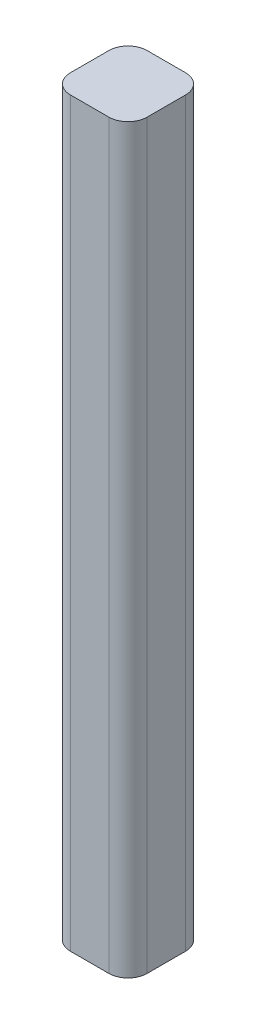
ISO-10303-21;
HEADER;
FILE_DESCRIPTION(('STEP AP214'),'2;1');
FILE_NAME('part.step','',(''),(''),'','','');
FILE_SCHEMA(('AUTOMOTIVE_DESIGN { 1 0 10303 214 1 1 1 1 }'));
ENDSEC;
DATA;
#1=APPLICATION_CONTEXT('core data for automotive mechanical design processes');
#2=APPLICATION_PROTOCOL_DEFINITION('international standard','automotive_design',2000,#1);
#3=PRODUCT_CONTEXT('',#1,'mechanical');
#4=PRODUCT('Part','Part','',(#3));
#5=PRODUCT_RELATED_PRODUCT_CATEGORY('part','',(#4));
#6=PRODUCT_DEFINITION_FORMATION('','',#4);
#7=PRODUCT_DEFINITION_CONTEXT('part definition',#1,'design');
#8=PRODUCT_DEFINITION('design','',#6,#7);
#9=PRODUCT_DEFINITION_SHAPE('','',#8);
#10=(LENGTH_UNIT() NAMED_UNIT(*) SI_UNIT(.MILLI.,.METRE.));
#11=(NAMED_UNIT(*) PLANE_ANGLE_UNIT() SI_UNIT($,.RADIAN.));
#12=(NAMED_UNIT(*) SI_UNIT($,.STERADIAN.) SOLID_ANGLE_UNIT());
#13=UNCERTAINTY_MEASURE_WITH_UNIT(LENGTH_MEASURE(1.E-05),#10,'distance_accuracy_value','');
#14=(GEOMETRIC_REPRESENTATION_CONTEXT(3) GLOBAL_UNCERTAINTY_ASSIGNED_CONTEXT((#13)) GLOBAL_UNIT_ASSIGNED_CONTEXT((#10,
#11,#12)) REPRESENTATION_CONTEXT('',''));
#15=CARTESIAN_POINT('',(0.,0.,0.));
#16=DIRECTION('',(0.,0.,1.));
#17=DIRECTION('',(1.,0.,0.));
#18=AXIS2_PLACEMENT_3D('',#15,#16,#17);
#19=CARTESIAN_POINT('',(2.,77.25,-2.));
#20=DIRECTION('',(0.,-1.,0.));
#21=DIRECTION('',(0.,0.,-1.));
#22=AXIS2_PLACEMENT_3D('',#19,#20,#21);
#23=CYLINDRICAL_SURFACE('',#22,2.);
#24=CARTESIAN_POINT('',(2.,0.,-2.));
#25=DIRECTION('',(0.,1.,0.));
#26=DIRECTION('',(0.,0.,-1.));
#27=AXIS2_PLACEMENT_3D('',#24,#25,#26);
#28=CIRCLE('',#27,2.);
#29=CARTESIAN_POINT('',(4.,0.,-2.));
#30=VERTEX_POINT('',#29);
#31=CARTESIAN_POINT('',(2.,0.,-4.));
#32=VERTEX_POINT('',#31);
#33=EDGE_CURVE('E129',#30,#32,#28,.T.);
#34=ORIENTED_EDGE('',*,*,#33,.T.);
#35=DIRECTION('',(0.,-1.,0.));
#36=VECTOR('',#35,1.);
#37=CARTESIAN_POINT('',(2.,77.25,-4.));
#38=LINE('',#37,#36);
#39=CARTESIAN_POINT('',(2.,77.25,-4.));
#40=VERTEX_POINT('',#39);
#41=EDGE_CURVE('E11',#40,#32,#38,.T.);
#42=ORIENTED_EDGE('',*,*,#41,.F.);
#43=CARTESIAN_POINT('',(2.,77.25,-2.));
#44=DIRECTION('',(0.,1.,0.));
#45=DIRECTION('',(0.,0.,-1.));
#46=AXIS2_PLACEMENT_3D('',#43,#44,#45);
#47=CIRCLE('',#46,2.);
#48=CARTESIAN_POINT('',(4.,77.25,-2.));
#49=VERTEX_POINT('',#48);
#50=EDGE_CURVE('E143',#49,#40,#47,.T.);
#51=ORIENTED_EDGE('',*,*,#50,.F.);
#52=DIRECTION('',(0.,-1.,0.));
#53=VECTOR('',#52,1.);
#54=CARTESIAN_POINT('',(4.,77.25,-2.));
#55=LINE('',#54,#53);
#56=EDGE_CURVE('E125',#49,#30,#55,.T.);
#57=ORIENTED_EDGE('',*,*,#56,.T.);
#58=EDGE_LOOP('',(#34,#42,#51,#57));
#59=FACE_BOUND('',#58,.T.);
#60=ADVANCED_FACE('F33',(#59),#23,.T.);
#61=CARTESIAN_POINT('',(-2.,77.25,-4.));
#62=DIRECTION('',(0.,0.,1.));
#63=DIRECTION('',(1.,0.,0.));
#64=AXIS2_PLACEMENT_3D('',#61,#62,#63);
#65=PLANE('',#64);
#66=DIRECTION('',(-1.,0.,0.));
#67=VECTOR('',#66,1.);
#68=CARTESIAN_POINT('',(-2.,0.,-4.));
#69=LINE('',#68,#67);
#70=CARTESIAN_POINT('',(-2.,0.,-4.));
#71=VERTEX_POINT('',#70);
#72=EDGE_CURVE('E132',#32,#71,#69,.T.);
#73=ORIENTED_EDGE('',*,*,#72,.T.);
#74=DIRECTION('',(0.,-1.,0.));
#75=VECTOR('',#74,1.);
#76=CARTESIAN_POINT('',(-2.,77.25,-4.));
#77=LINE('',#76,#75);
#78=CARTESIAN_POINT('',(-2.,77.25,-4.));
#79=VERTEX_POINT('',#78);
#80=EDGE_CURVE('E41',#79,#71,#77,.T.);
#81=ORIENTED_EDGE('',*,*,#80,.F.);
#82=DIRECTION('',(-1.,0.,0.));
#83=VECTOR('',#82,1.);
#84=CARTESIAN_POINT('',(-2.,77.25,-4.));
#85=LINE('',#84,#83);
#86=EDGE_CURVE('E92',#40,#79,#85,.T.);
#87=ORIENTED_EDGE('',*,*,#86,.F.);
#88=ORIENTED_EDGE('',*,*,#41,.T.);
#89=EDGE_LOOP('',(#73,#81,#87,#88));
#90=FACE_BOUND('',#89,.T.);
#91=ADVANCED_FACE('F178',(#90),#65,.F.);
#92=CARTESIAN_POINT('',(-2.,77.25,-2.));
#93=DIRECTION('',(0.,-1.,0.));
#94=DIRECTION('',(0.,0.,-1.));
#95=AXIS2_PLACEMENT_3D('',#92,#93,#94);
#96=CYLINDRICAL_SURFACE('',#95,2.);
#97=CARTESIAN_POINT('',(-2.,0.,-2.));
#98=DIRECTION('',(0.,1.,0.));
#99=DIRECTION('',(0.,0.,-1.));
#100=AXIS2_PLACEMENT_3D('',#97,#98,#99);
#101=CIRCLE('',#100,2.);
#102=CARTESIAN_POINT('',(-4.,0.,-2.));
#103=VERTEX_POINT('',#102);
#104=EDGE_CURVE('E134',#71,#103,#101,.T.);
#105=ORIENTED_EDGE('',*,*,#104,.T.);
#106=DIRECTION('',(0.,-1.,0.));
#107=VECTOR('',#106,1.);
#108=CARTESIAN_POINT('',(-4.,77.25,-2.));
#109=LINE('',#108,#107);
#110=CARTESIAN_POINT('',(-4.,77.25,-2.));
#111=VERTEX_POINT('',#110);
#112=EDGE_CURVE('E150',#111,#103,#109,.T.);
#113=ORIENTED_EDGE('',*,*,#112,.F.);
#114=CARTESIAN_POINT('',(-2.,77.25,-2.));
#115=DIRECTION('',(0.,1.,0.));
#116=DIRECTION('',(0.,0.,-1.));
#117=AXIS2_PLACEMENT_3D('',#114,#115,#116);
#118=CIRCLE('',#117,2.);
#119=EDGE_CURVE('E158',#79,#111,#118,.T.);
#120=ORIENTED_EDGE('',*,*,#119,.F.);
#121=ORIENTED_EDGE('',*,*,#80,.T.);
#122=EDGE_LOOP('',(#105,#113,#120,#121));
#123=FACE_BOUND('',#122,.T.);
#124=ADVANCED_FACE('F156',(#123),#96,.T.);
#125=CARTESIAN_POINT('',(-4.,77.25,2.));
#126=DIRECTION('',(1.,0.,0.));
#127=DIRECTION('',(0.,0.,-1.));
#128=AXIS2_PLACEMENT_3D('',#125,#126,#127);
#129=PLANE('',#128);
#130=DIRECTION('',(0.,0.,1.));
#131=VECTOR('',#130,1.);
#132=CARTESIAN_POINT('',(-4.,0.,2.));
#133=LINE('',#132,#131);
#134=CARTESIAN_POINT('',(-4.,0.,2.));
#135=VERTEX_POINT('',#134);
#136=EDGE_CURVE('E136',#103,#135,#133,.T.);
#137=ORIENTED_EDGE('',*,*,#136,.T.);
#138=DIRECTION('',(0.,-1.,0.));
#139=VECTOR('',#138,1.);
#140=CARTESIAN_POINT('',(-4.,77.25,2.));
#141=LINE('',#140,#139);
#142=CARTESIAN_POINT('',(-4.,77.25,2.));
#143=VERTEX_POINT('',#142);
#144=EDGE_CURVE('E147',#143,#135,#141,.T.);
#145=ORIENTED_EDGE('',*,*,#144,.F.);
#146=DIRECTION('',(0.,0.,1.));
#147=VECTOR('',#146,1.);
#148=CARTESIAN_POINT('',(-4.,77.25,2.));
#149=LINE('',#148,#147);
#150=EDGE_CURVE('E170',#111,#143,#149,.T.);
#151=ORIENTED_EDGE('',*,*,#150,.F.);
#152=ORIENTED_EDGE('',*,*,#112,.T.);
#153=EDGE_LOOP('',(#137,#145,#151,#152));
#154=FACE_BOUND('',#153,.T.);
#155=ADVANCED_FACE('F166',(#154),#129,.F.);
#156=CARTESIAN_POINT('',(-2.,77.25,2.));
#157=DIRECTION('',(0.,-1.,0.));
#158=DIRECTION('',(0.,0.,-1.));
#159=AXIS2_PLACEMENT_3D('',#156,#157,#158);
#160=CYLINDRICAL_SURFACE('',#159,2.);
#161=CARTESIAN_POINT('',(-2.,0.,2.));
#162=DIRECTION('',(0.,1.,0.));
#163=DIRECTION('',(0.,0.,-1.));
#164=AXIS2_PLACEMENT_3D('',#161,#162,#163);
#165=CIRCLE('',#164,2.);
#166=CARTESIAN_POINT('',(-2.,0.,4.));
#167=VERTEX_POINT('',#166);
#168=EDGE_CURVE('E138',#135,#167,#165,.T.);
#169=ORIENTED_EDGE('',*,*,#168,.T.);
#170=DIRECTION('',(0.,-1.,0.));
#171=VECTOR('',#170,1.);
#172=CARTESIAN_POINT('',(-2.,77.25,4.));
#173=LINE('',#172,#171);
#174=CARTESIAN_POINT('',(-2.,77.25,4.));
#175=VERTEX_POINT('',#174);
#176=EDGE_CURVE('E120',#175,#167,#173,.T.);
#177=ORIENTED_EDGE('',*,*,#176,.F.);
#178=CARTESIAN_POINT('',(-2.,77.25,2.));
#179=DIRECTION('',(0.,1.,0.));
#180=DIRECTION('',(0.,0.,-1.));
#181=AXIS2_PLACEMENT_3D('',#178,#179,#180);
#182=CIRCLE('',#181,2.);
#183=EDGE_CURVE('E111',#143,#175,#182,.T.);
#184=ORIENTED_EDGE('',*,*,#183,.F.);
#185=ORIENTED_EDGE('',*,*,#144,.T.);
#186=EDGE_LOOP('',(#169,#177,#184,#185));
#187=FACE_BOUND('',#186,.T.);
#188=ADVANCED_FACE('F169',(#187),#160,.T.);
#189=CARTESIAN_POINT('',(-2.,77.25,4.));
#190=DIRECTION('',(0.,0.,-1.));
#191=DIRECTION('',(-1.,0.,0.));
#192=AXIS2_PLACEMENT_3D('',#189,#190,#191);
#193=PLANE('',#192);
#194=DIRECTION('',(1.,0.,0.));
#195=VECTOR('',#194,1.);
#196=CARTESIAN_POINT('',(-2.,0.,4.));
#197=LINE('',#196,#195);
#198=CARTESIAN_POINT('',(2.,0.,4.));
#199=VERTEX_POINT('',#198);
#200=EDGE_CURVE('E119',#167,#199,#197,.T.);
#201=ORIENTED_EDGE('',*,*,#200,.T.);
#202=DIRECTION('',(0.,-1.,0.));
#203=VECTOR('',#202,1.);
#204=CARTESIAN_POINT('',(2.,77.25,4.));
#205=LINE('',#204,#203);
#206=CARTESIAN_POINT('',(2.,77.25,4.));
#207=VERTEX_POINT('',#206);
#208=EDGE_CURVE('E116',#207,#199,#205,.T.);
#209=ORIENTED_EDGE('',*,*,#208,.F.);
#210=DIRECTION('',(1.,0.,0.));
#211=VECTOR('',#210,1.);
#212=CARTESIAN_POINT('',(-2.,77.25,4.));
#213=LINE('',#212,#211);
#214=EDGE_CURVE('E105',#175,#207,#213,.T.);
#215=ORIENTED_EDGE('',*,*,#214,.F.);
#216=ORIENTED_EDGE('',*,*,#176,.T.);
#217=EDGE_LOOP('',(#201,#209,#215,#216));
#218=FACE_BOUND('',#217,.T.);
#219=ADVANCED_FACE('F117',(#218),#193,.F.);
#220=CARTESIAN_POINT('',(2.,77.25,2.));
#221=DIRECTION('',(0.,-1.,0.));
#222=DIRECTION('',(0.,0.,-1.));
#223=AXIS2_PLACEMENT_3D('',#220,#221,#222);
#224=CYLINDRICAL_SURFACE('',#223,2.);
#225=CARTESIAN_POINT('',(2.,0.,2.));
#226=DIRECTION('',(0.,1.,0.));
#227=DIRECTION('',(0.,0.,-1.));
#228=AXIS2_PLACEMENT_3D('',#225,#226,#227);
#229=CIRCLE('',#228,2.);
#230=CARTESIAN_POINT('',(4.,0.,2.));
#231=VERTEX_POINT('',#230);
#232=EDGE_CURVE('E78',#199,#231,#229,.T.);
#233=ORIENTED_EDGE('',*,*,#232,.T.);
#234=DIRECTION('',(0.,-1.,0.));
#235=VECTOR('',#234,1.);
#236=CARTESIAN_POINT('',(4.,77.25,2.));
#237=LINE('',#236,#235);
#238=CARTESIAN_POINT('',(4.,77.25,2.));
#239=VERTEX_POINT('',#238);
#240=EDGE_CURVE('E121',#239,#231,#237,.T.);
#241=ORIENTED_EDGE('',*,*,#240,.F.);
#242=CARTESIAN_POINT('',(2.,77.25,2.));
#243=DIRECTION('',(0.,1.,0.));
#244=DIRECTION('',(0.,0.,-1.));
#245=AXIS2_PLACEMENT_3D('',#242,#243,#244);
#246=CIRCLE('',#245,2.);
#247=EDGE_CURVE('E109',#207,#239,#246,.T.);
#248=ORIENTED_EDGE('',*,*,#247,.F.);
#249=ORIENTED_EDGE('',*,*,#208,.T.);
#250=EDGE_LOOP('',(#233,#241,#248,#249));
#251=FACE_BOUND('',#250,.T.);
#252=ADVANCED_FACE('F123',(#251),#224,.T.);
#253=CARTESIAN_POINT('',(4.,77.25,2.));
#254=DIRECTION('',(-1.,0.,0.));
#255=DIRECTION('',(0.,0.,1.));
#256=AXIS2_PLACEMENT_3D('',#253,#254,#255);
#257=PLANE('',#256);
#258=DIRECTION('',(0.,0.,-1.));
#259=VECTOR('',#258,1.);
#260=CARTESIAN_POINT('',(4.,0.,2.));
#261=LINE('',#260,#259);
#262=EDGE_CURVE('E84',#231,#30,#261,.T.);
#263=ORIENTED_EDGE('',*,*,#262,.T.);
#264=ORIENTED_EDGE('',*,*,#56,.F.);
#265=DIRECTION('',(0.,0.,-1.));
#266=VECTOR('',#265,1.);
#267=CARTESIAN_POINT('',(4.,77.25,2.));
#268=LINE('',#267,#266);
#269=EDGE_CURVE('E49',#239,#49,#268,.T.);
#270=ORIENTED_EDGE('',*,*,#269,.F.);
#271=ORIENTED_EDGE('',*,*,#240,.T.);
#272=EDGE_LOOP('',(#263,#264,#270,#271));
#273=FACE_BOUND('',#272,.T.);
#274=ADVANCED_FACE('F194',(#273),#257,.F.);
#275=CARTESIAN_POINT('',(2.,77.25,-2.));
#276=DIRECTION('',(0.,-1.,0.));
#277=DIRECTION('',(0.,0.,-1.));
#278=AXIS2_PLACEMENT_3D('',#275,#276,#277);
#279=PLANE('',#278);
#280=ORIENTED_EDGE('',*,*,#50,.T.);
#281=ORIENTED_EDGE('',*,*,#86,.T.);
#282=ORIENTED_EDGE('',*,*,#119,.T.);
#283=ORIENTED_EDGE('',*,*,#150,.T.);
#284=ORIENTED_EDGE('',*,*,#183,.T.);
#285=ORIENTED_EDGE('',*,*,#214,.T.);
#286=ORIENTED_EDGE('',*,*,#247,.T.);
#287=ORIENTED_EDGE('',*,*,#269,.T.);
#288=EDGE_LOOP('',(#280,#281,#282,#283,#284,#285,#286,#287));
#289=FACE_BOUND('',#288,.T.);
#290=ADVANCED_FACE('F107',(#289),#279,.F.);
#291=CARTESIAN_POINT('',(2.,0.,-2.));
#292=DIRECTION('',(0.,-1.,0.));
#293=DIRECTION('',(0.,0.,-1.));
#294=AXIS2_PLACEMENT_3D('',#291,#292,#293);
#295=PLANE('',#294);
#296=ORIENTED_EDGE('',*,*,#33,.F.);
#297=ORIENTED_EDGE('',*,*,#262,.F.);
#298=ORIENTED_EDGE('',*,*,#232,.F.);
#299=ORIENTED_EDGE('',*,*,#200,.F.);
#300=ORIENTED_EDGE('',*,*,#168,.F.);
#301=ORIENTED_EDGE('',*,*,#136,.F.);
#302=ORIENTED_EDGE('',*,*,#104,.F.);
#303=ORIENTED_EDGE('',*,*,#72,.F.);
#304=EDGE_LOOP('',(#296,#297,#298,#299,#300,#301,#302,#303));
#305=FACE_BOUND('',#304,.T.);
#306=ADVANCED_FACE('F162',(#305),#295,.T.);
#307=CLOSED_SHELL('',(#60,#91,#124,#155,#188,#219,#252,#274,#290,#306));
#308=MANIFOLD_SOLID_BREP('B2',#307);
#309=ADVANCED_BREP_SHAPE_REPRESENTATION('',(#18,#308),#14);
#310=SHAPE_DEFINITION_REPRESENTATION(#9,#309);
ENDSEC;
END-ISO-10303-21;
